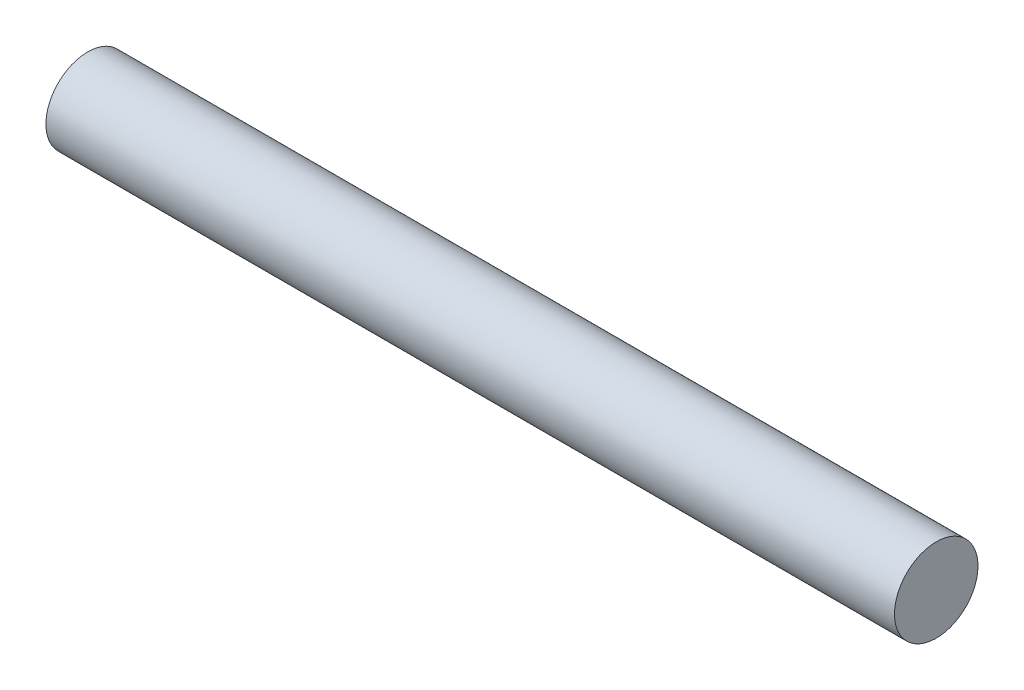
ISO-10303-21;
HEADER;
FILE_DESCRIPTION(('STEP AP214'),'2;1');
FILE_NAME('part.step','',(''),(''),'','','');
FILE_SCHEMA(('AUTOMOTIVE_DESIGN { 1 0 10303 214 1 1 1 1 }'));
ENDSEC;
DATA;
#1=APPLICATION_CONTEXT('core data for automotive mechanical design processes');
#2=APPLICATION_PROTOCOL_DEFINITION('international standard','automotive_design',2000,#1);
#3=PRODUCT_CONTEXT('',#1,'mechanical');
#4=PRODUCT('Part','Part','',(#3));
#5=PRODUCT_RELATED_PRODUCT_CATEGORY('part','',(#4));
#6=PRODUCT_DEFINITION_FORMATION('','',#4);
#7=PRODUCT_DEFINITION_CONTEXT('part definition',#1,'design');
#8=PRODUCT_DEFINITION('design','',#6,#7);
#9=PRODUCT_DEFINITION_SHAPE('','',#8);
#10=(LENGTH_UNIT() NAMED_UNIT(*) SI_UNIT(.MILLI.,.METRE.));
#11=(NAMED_UNIT(*) PLANE_ANGLE_UNIT() SI_UNIT($,.RADIAN.));
#12=(NAMED_UNIT(*) SI_UNIT($,.STERADIAN.) SOLID_ANGLE_UNIT());
#13=UNCERTAINTY_MEASURE_WITH_UNIT(LENGTH_MEASURE(1.E-05),#10,'distance_accuracy_value','');
#14=(GEOMETRIC_REPRESENTATION_CONTEXT(3) GLOBAL_UNCERTAINTY_ASSIGNED_CONTEXT((#13)) GLOBAL_UNIT_ASSIGNED_CONTEXT((#10,
#11,#12)) REPRESENTATION_CONTEXT('',''));
#15=CARTESIAN_POINT('',(0.,0.,0.));
#16=DIRECTION('',(0.,0.,1.));
#17=DIRECTION('',(1.,0.,0.));
#18=AXIS2_PLACEMENT_3D('',#15,#16,#17);
#19=CARTESIAN_POINT('',(50.8,0.,0.));
#20=DIRECTION('',(-1.,0.,0.));
#21=DIRECTION('',(0.,0.,1.));
#22=AXIS2_PLACEMENT_3D('',#19,#20,#21);
#23=CYLINDRICAL_SURFACE('',#22,2.5);
#24=CARTESIAN_POINT('',(50.8,0.,0.));
#25=DIRECTION('',(1.,0.,0.));
#26=DIRECTION('',(0.,0.,-1.));
#27=AXIS2_PLACEMENT_3D('',#24,#25,#26);
#28=CIRCLE('',#27,2.5);
#29=CARTESIAN_POINT('',(50.8,0.,-2.5));
#30=VERTEX_POINT('',#29);
#31=EDGE_CURVE('E10',#30,#30,#28,.T.);
#32=ORIENTED_EDGE('',*,*,#31,.F.);
#33=EDGE_LOOP('',(#32));
#34=FACE_BOUND('',#33,.T.);
#35=CARTESIAN_POINT('',(0.,0.,0.));
#36=DIRECTION('',(1.,0.,0.));
#37=DIRECTION('',(0.,0.,-1.));
#38=AXIS2_PLACEMENT_3D('',#35,#36,#37);
#39=CIRCLE('',#38,2.5);
#40=CARTESIAN_POINT('',(0.,0.,-2.5));
#41=VERTEX_POINT('',#40);
#42=EDGE_CURVE('E40',#41,#41,#39,.T.);
#43=ORIENTED_EDGE('',*,*,#42,.T.);
#44=EDGE_LOOP('',(#43));
#45=FACE_BOUND('',#44,.T.);
#46=ADVANCED_FACE('F37',(#34,#45),#23,.T.);
#47=CARTESIAN_POINT('',(50.8,0.,0.));
#48=DIRECTION('',(1.,0.,0.));
#49=DIRECTION('',(0.,0.,-1.));
#50=AXIS2_PLACEMENT_3D('',#47,#48,#49);
#51=PLANE('',#50);
#52=ORIENTED_EDGE('',*,*,#31,.T.);
#53=EDGE_LOOP('',(#52));
#54=FACE_BOUND('',#53,.T.);
#55=ADVANCED_FACE('F54',(#54),#51,.T.);
#56=CARTESIAN_POINT('',(0.,0.,0.));
#57=DIRECTION('',(1.,0.,0.));
#58=DIRECTION('',(0.,0.,-1.));
#59=AXIS2_PLACEMENT_3D('',#56,#57,#58);
#60=PLANE('',#59);
#61=ORIENTED_EDGE('',*,*,#42,.F.);
#62=EDGE_LOOP('',(#61));
#63=FACE_BOUND('',#62,.T.);
#64=ADVANCED_FACE('F52',(#63),#60,.F.);
#65=CLOSED_SHELL('',(#46,#55,#64));
#66=MANIFOLD_SOLID_BREP('B2',#65);
#67=ADVANCED_BREP_SHAPE_REPRESENTATION('',(#18,#66),#14);
#68=SHAPE_DEFINITION_REPRESENTATION(#9,#67);
ENDSEC;
END-ISO-10303-21;
